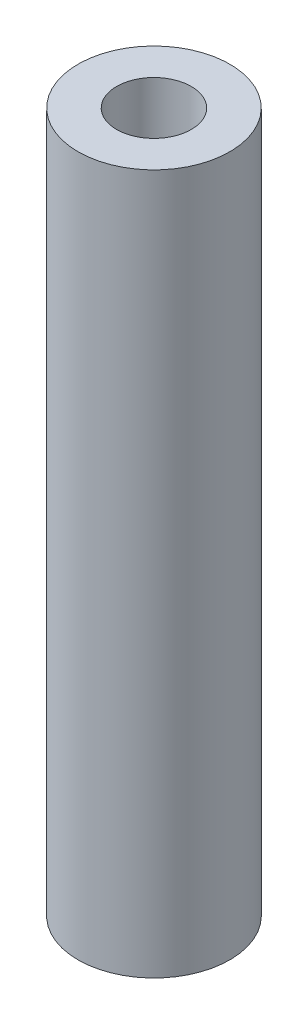
ISO-10303-21;
HEADER;
FILE_DESCRIPTION(('STEP AP214'),'2;1');
FILE_NAME('part.step','',(''),(''),'','','');
FILE_SCHEMA(('AUTOMOTIVE_DESIGN { 1 0 10303 214 1 1 1 1 }'));
ENDSEC;
DATA;
#1=APPLICATION_CONTEXT('core data for automotive mechanical design processes');
#2=APPLICATION_PROTOCOL_DEFINITION('international standard','automotive_design',2000,#1);
#3=PRODUCT_CONTEXT('',#1,'mechanical');
#4=PRODUCT('Part','Part','',(#3));
#5=PRODUCT_RELATED_PRODUCT_CATEGORY('part','',(#4));
#6=PRODUCT_DEFINITION_FORMATION('','',#4);
#7=PRODUCT_DEFINITION_CONTEXT('part definition',#1,'design');
#8=PRODUCT_DEFINITION('design','',#6,#7);
#9=PRODUCT_DEFINITION_SHAPE('','',#8);
#10=(LENGTH_UNIT() NAMED_UNIT(*) SI_UNIT(.MILLI.,.METRE.));
#11=(NAMED_UNIT(*) PLANE_ANGLE_UNIT() SI_UNIT($,.RADIAN.));
#12=(NAMED_UNIT(*) SI_UNIT($,.STERADIAN.) SOLID_ANGLE_UNIT());
#13=UNCERTAINTY_MEASURE_WITH_UNIT(LENGTH_MEASURE(1.E-05),#10,'distance_accuracy_value','');
#14=(GEOMETRIC_REPRESENTATION_CONTEXT(3) GLOBAL_UNCERTAINTY_ASSIGNED_CONTEXT((#13)) GLOBAL_UNIT_ASSIGNED_CONTEXT((#10,
#11,#12)) REPRESENTATION_CONTEXT('',''));
#15=CARTESIAN_POINT('',(0.,0.,0.));
#16=DIRECTION('',(0.,0.,1.));
#17=DIRECTION('',(1.,0.,0.));
#18=AXIS2_PLACEMENT_3D('',#15,#16,#17);
#19=CARTESIAN_POINT('',(0.,38.1,0.));
#20=DIRECTION('',(0.,-1.,0.));
#21=DIRECTION('',(0.,0.,-1.));
#22=AXIS2_PLACEMENT_3D('',#19,#20,#21);
#23=CYLINDRICAL_SURFACE('',#22,4.131274567);
#24=CARTESIAN_POINT('',(0.,38.1,0.));
#25=DIRECTION('',(0.,1.,0.));
#26=DIRECTION('',(0.,0.,1.));
#27=AXIS2_PLACEMENT_3D('',#24,#25,#26);
#28=CIRCLE('',#27,4.131274567);
#29=CARTESIAN_POINT('',(0.,38.1,4.131274567));
#30=VERTEX_POINT('',#29);
#31=EDGE_CURVE('E10',#30,#30,#28,.T.);
#32=ORIENTED_EDGE('',*,*,#31,.F.);
#33=EDGE_LOOP('',(#32));
#34=FACE_BOUND('',#33,.T.);
#35=CARTESIAN_POINT('',(0.,0.,0.));
#36=DIRECTION('',(0.,1.,0.));
#37=DIRECTION('',(0.,0.,1.));
#38=AXIS2_PLACEMENT_3D('',#35,#36,#37);
#39=CIRCLE('',#38,4.131274567);
#40=CARTESIAN_POINT('',(0.,0.,4.131274567));
#41=VERTEX_POINT('',#40);
#42=EDGE_CURVE('E33',#41,#41,#39,.T.);
#43=ORIENTED_EDGE('',*,*,#42,.T.);
#44=EDGE_LOOP('',(#43));
#45=FACE_BOUND('',#44,.T.);
#46=ADVANCED_FACE('F30',(#34,#45),#23,.T.);
#47=CARTESIAN_POINT('',(0.,38.1,0.));
#48=DIRECTION('',(0.,1.,0.));
#49=DIRECTION('',(0.,0.,1.));
#50=AXIS2_PLACEMENT_3D('',#47,#48,#49);
#51=PLANE('',#50);
#52=CARTESIAN_POINT('',(0.,38.1,0.));
#53=DIRECTION('',(0.,1.,0.));
#54=DIRECTION('',(0.,0.,1.));
#55=AXIS2_PLACEMENT_3D('',#52,#53,#54);
#56=CIRCLE('',#55,2.032);
#57=CARTESIAN_POINT('',(0.,38.1,2.032));
#58=VERTEX_POINT('',#57);
#59=EDGE_CURVE('E42',#58,#58,#56,.T.);
#60=ORIENTED_EDGE('',*,*,#59,.F.);
#61=EDGE_LOOP('',(#60));
#62=FACE_BOUND('',#61,.T.);
#63=ORIENTED_EDGE('',*,*,#31,.T.);
#64=EDGE_LOOP('',(#63));
#65=FACE_BOUND('',#64,.T.);
#66=ADVANCED_FACE('F57',(#62,#65),#51,.T.);
#67=CARTESIAN_POINT('',(0.,0.,0.));
#68=DIRECTION('',(0.,1.,0.));
#69=DIRECTION('',(0.,0.,1.));
#70=AXIS2_PLACEMENT_3D('',#67,#68,#69);
#71=PLANE('',#70);
#72=CARTESIAN_POINT('',(0.,0.,0.));
#73=DIRECTION('',(0.,1.,0.));
#74=DIRECTION('',(0.,0.,1.));
#75=AXIS2_PLACEMENT_3D('',#72,#73,#74);
#76=CIRCLE('',#75,2.032);
#77=CARTESIAN_POINT('',(0.,0.,2.032));
#78=VERTEX_POINT('',#77);
#79=EDGE_CURVE('E40',#78,#78,#76,.T.);
#80=ORIENTED_EDGE('',*,*,#79,.T.);
#81=EDGE_LOOP('',(#80));
#82=FACE_BOUND('',#81,.T.);
#83=ORIENTED_EDGE('',*,*,#42,.F.);
#84=EDGE_LOOP('',(#83));
#85=FACE_BOUND('',#84,.T.);
#86=ADVANCED_FACE('F48',(#82,#85),#71,.F.);
#87=CARTESIAN_POINT('',(0.,0.,0.));
#88=DIRECTION('',(0.,1.,0.));
#89=DIRECTION('',(0.,0.,1.));
#90=AXIS2_PLACEMENT_3D('',#87,#88,#89);
#91=CYLINDRICAL_SURFACE('',#90,2.032);
#92=ORIENTED_EDGE('',*,*,#79,.F.);
#93=EDGE_LOOP('',(#92));
#94=FACE_BOUND('',#93,.T.);
#95=ORIENTED_EDGE('',*,*,#59,.T.);
#96=EDGE_LOOP('',(#95));
#97=FACE_BOUND('',#96,.T.);
#98=ADVANCED_FACE('F51',(#94,#97),#91,.F.);
#99=CLOSED_SHELL('',(#46,#66,#86,#98));
#100=MANIFOLD_SOLID_BREP('B2',#99);
#101=ADVANCED_BREP_SHAPE_REPRESENTATION('',(#18,#100),#14);
#102=SHAPE_DEFINITION_REPRESENTATION(#9,#101);
ENDSEC;
END-ISO-10303-21;
